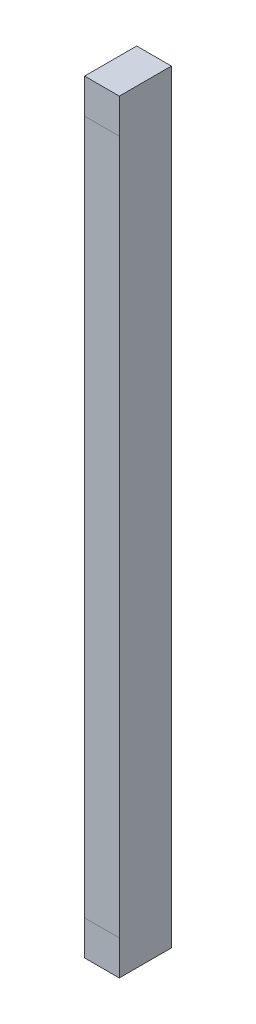
ISO-10303-21;
HEADER;
FILE_DESCRIPTION(('STEP AP214'),'2;1');
FILE_NAME('part.step','',(''),(''),'','','');
FILE_SCHEMA(('AUTOMOTIVE_DESIGN { 1 0 10303 214 1 1 1 1 }'));
ENDSEC;
DATA;
#1=APPLICATION_CONTEXT('core data for automotive mechanical design processes');
#2=APPLICATION_PROTOCOL_DEFINITION('international standard','automotive_design',2000,#1);
#3=PRODUCT_CONTEXT('',#1,'mechanical');
#4=PRODUCT('Part','Part','',(#3));
#5=PRODUCT_RELATED_PRODUCT_CATEGORY('part','',(#4));
#6=PRODUCT_DEFINITION_FORMATION('','',#4);
#7=PRODUCT_DEFINITION_CONTEXT('part definition',#1,'design');
#8=PRODUCT_DEFINITION('design','',#6,#7);
#9=PRODUCT_DEFINITION_SHAPE('','',#8);
#10=(LENGTH_UNIT() NAMED_UNIT(*) SI_UNIT(.MILLI.,.METRE.));
#11=(NAMED_UNIT(*) PLANE_ANGLE_UNIT() SI_UNIT($,.RADIAN.));
#12=(NAMED_UNIT(*) SI_UNIT($,.STERADIAN.) SOLID_ANGLE_UNIT());
#13=UNCERTAINTY_MEASURE_WITH_UNIT(LENGTH_MEASURE(1.E-05),#10,'distance_accuracy_value','');
#14=(GEOMETRIC_REPRESENTATION_CONTEXT(3) GLOBAL_UNCERTAINTY_ASSIGNED_CONTEXT((#13)) GLOBAL_UNIT_ASSIGNED_CONTEXT((#10,
#11,#12)) REPRESENTATION_CONTEXT('',''));
#15=CARTESIAN_POINT('',(0.,0.,0.));
#16=DIRECTION('',(0.,0.,1.));
#17=DIRECTION('',(1.,0.,0.));
#18=AXIS2_PLACEMENT_3D('',#15,#16,#17);
#19=CARTESIAN_POINT('',(0.,2200.,0.));
#20=DIRECTION('',(0.,0.,-1.));
#21=DIRECTION('',(-1.,0.,0.));
#22=AXIS2_PLACEMENT_3D('',#19,#20,#21);
#23=PLANE('',#22);
#24=DIRECTION('',(1.,0.,0.));
#25=VECTOR('',#24,1.);
#26=CARTESIAN_POINT('',(-1.74860126378462E-12,100.,0.));
#27=LINE('',#26,#25);
#28=CARTESIAN_POINT('',(0.,100.,0.));
#29=VERTEX_POINT('',#28);
#30=CARTESIAN_POINT('',(100.,100.,0.));
#31=VERTEX_POINT('',#30);
#32=EDGE_CURVE('E11',#29,#31,#27,.T.);
#33=ORIENTED_EDGE('',*,*,#32,.F.);
#34=DIRECTION('',(0.,-1.,0.));
#35=VECTOR('',#34,1.);
#36=CARTESIAN_POINT('',(0.,2200.,0.));
#37=LINE('',#36,#35);
#38=CARTESIAN_POINT('',(0.,0.,0.));
#39=VERTEX_POINT('',#38);
#40=EDGE_CURVE('E126',#29,#39,#37,.T.);
#41=ORIENTED_EDGE('',*,*,#40,.T.);
#42=DIRECTION('',(1.,0.,0.));
#43=VECTOR('',#42,1.);
#44=CARTESIAN_POINT('',(0.,0.,0.));
#45=LINE('',#44,#43);
#46=CARTESIAN_POINT('',(100.,0.,0.));
#47=VERTEX_POINT('',#46);
#48=EDGE_CURVE('E147',#39,#47,#45,.T.);
#49=ORIENTED_EDGE('',*,*,#48,.T.);
#50=DIRECTION('',(0.,-1.,0.));
#51=VECTOR('',#50,1.);
#52=CARTESIAN_POINT('',(100.,2200.,0.));
#53=LINE('',#52,#51);
#54=EDGE_CURVE('E132',#31,#47,#53,.T.);
#55=ORIENTED_EDGE('',*,*,#54,.F.);
#56=EDGE_LOOP('',(#33,#41,#49,#55));
#57=FACE_BOUND('',#56,.T.);
#58=ADVANCED_FACE('F49',(#57),#23,.F.);
#59=CARTESIAN_POINT('',(0.,2100.,0.));
#60=VERTEX_POINT('',#59);
#61=EDGE_CURVE('E124',#60,#29,#37,.T.);
#62=ORIENTED_EDGE('',*,*,#61,.T.);
#63=ORIENTED_EDGE('',*,*,#32,.T.);
#64=CARTESIAN_POINT('',(100.,2100.,0.));
#65=VERTEX_POINT('',#64);
#66=EDGE_CURVE('E131',#65,#31,#53,.T.);
#67=ORIENTED_EDGE('',*,*,#66,.F.);
#68=DIRECTION('',(1.,0.,0.));
#69=VECTOR('',#68,1.);
#70=CARTESIAN_POINT('',(0.,2100.,0.));
#71=LINE('',#70,#69);
#72=EDGE_CURVE('E58',#60,#65,#71,.T.);
#73=ORIENTED_EDGE('',*,*,#72,.F.);
#74=EDGE_LOOP('',(#62,#63,#67,#73));
#75=FACE_BOUND('',#74,.T.);
#76=ADVANCED_FACE('F158',(#75),#23,.F.);
#77=CARTESIAN_POINT('',(0.,2200.,0.));
#78=DIRECTION('',(1.,0.,0.));
#79=DIRECTION('',(0.,0.,-1.));
#80=AXIS2_PLACEMENT_3D('',#77,#78,#79);
#81=PLANE('',#80);
#82=DIRECTION('',(0.,0.,1.));
#83=VECTOR('',#82,1.);
#84=CARTESIAN_POINT('',(0.,0.,0.));
#85=LINE('',#84,#83);
#86=CARTESIAN_POINT('',(0.,0.,-150.));
#87=VERTEX_POINT('',#86);
#88=EDGE_CURVE('E149',#87,#39,#85,.T.);
#89=ORIENTED_EDGE('',*,*,#88,.T.);
#90=ORIENTED_EDGE('',*,*,#40,.F.);
#91=ORIENTED_EDGE('',*,*,#61,.F.);
#92=CARTESIAN_POINT('',(0.,2200.,0.));
#93=VERTEX_POINT('',#92);
#94=EDGE_CURVE('E105',#93,#60,#37,.T.);
#95=ORIENTED_EDGE('',*,*,#94,.F.);
#96=DIRECTION('',(0.,0.,1.));
#97=VECTOR('',#96,1.);
#98=CARTESIAN_POINT('',(0.,2200.,0.));
#99=LINE('',#98,#97);
#100=CARTESIAN_POINT('',(0.,2200.,-150.));
#101=VERTEX_POINT('',#100);
#102=EDGE_CURVE('E111',#101,#93,#99,.T.);
#103=ORIENTED_EDGE('',*,*,#102,.F.);
#104=DIRECTION('',(0.,-1.,0.));
#105=VECTOR('',#104,1.);
#106=CARTESIAN_POINT('',(0.,2200.,-150.));
#107=LINE('',#106,#105);
#108=EDGE_CURVE('E138',#101,#87,#107,.T.);
#109=ORIENTED_EDGE('',*,*,#108,.T.);
#110=EDGE_LOOP('',(#89,#90,#91,#95,#103,#109));
#111=FACE_BOUND('',#110,.T.);
#112=ADVANCED_FACE('F51',(#111),#81,.F.);
#113=ORIENTED_EDGE('',*,*,#94,.T.);
#114=ORIENTED_EDGE('',*,*,#72,.T.);
#115=CARTESIAN_POINT('',(100.,2200.,0.));
#116=VERTEX_POINT('',#115);
#117=EDGE_CURVE('E107',#116,#65,#53,.T.);
#118=ORIENTED_EDGE('',*,*,#117,.F.);
#119=DIRECTION('',(1.,0.,0.));
#120=VECTOR('',#119,1.);
#121=CARTESIAN_POINT('',(0.,2200.,0.));
#122=LINE('',#121,#120);
#123=EDGE_CURVE('E101',#93,#116,#122,.T.);
#124=ORIENTED_EDGE('',*,*,#123,.F.);
#125=EDGE_LOOP('',(#113,#114,#118,#124));
#126=FACE_BOUND('',#125,.T.);
#127=ADVANCED_FACE('F103',(#126),#23,.F.);
#128=CARTESIAN_POINT('',(100.,2200.,0.));
#129=DIRECTION('',(-1.,0.,0.));
#130=DIRECTION('',(0.,0.,1.));
#131=AXIS2_PLACEMENT_3D('',#128,#129,#130);
#132=PLANE('',#131);
#133=DIRECTION('',(0.,0.,-1.));
#134=VECTOR('',#133,1.);
#135=CARTESIAN_POINT('',(100.,0.,0.));
#136=LINE('',#135,#134);
#137=CARTESIAN_POINT('',(100.,0.,-150.));
#138=VERTEX_POINT('',#137);
#139=EDGE_CURVE('E145',#47,#138,#136,.T.);
#140=ORIENTED_EDGE('',*,*,#139,.T.);
#141=DIRECTION('',(0.,-1.,0.));
#142=VECTOR('',#141,1.);
#143=CARTESIAN_POINT('',(100.,2200.,-150.));
#144=LINE('',#143,#142);
#145=CARTESIAN_POINT('',(100.,2200.,-150.));
#146=VERTEX_POINT('',#145);
#147=EDGE_CURVE('E136',#146,#138,#144,.T.);
#148=ORIENTED_EDGE('',*,*,#147,.F.);
#149=DIRECTION('',(0.,0.,-1.));
#150=VECTOR('',#149,1.);
#151=CARTESIAN_POINT('',(100.,2200.,0.));
#152=LINE('',#151,#150);
#153=EDGE_CURVE('E110',#116,#146,#152,.T.);
#154=ORIENTED_EDGE('',*,*,#153,.F.);
#155=ORIENTED_EDGE('',*,*,#117,.T.);
#156=ORIENTED_EDGE('',*,*,#66,.T.);
#157=ORIENTED_EDGE('',*,*,#54,.T.);
#158=EDGE_LOOP('',(#140,#148,#154,#155,#156,#157));
#159=FACE_BOUND('',#158,.T.);
#160=ADVANCED_FACE('F152',(#159),#132,.F.);
#161=CARTESIAN_POINT('',(0.,2200.,-150.));
#162=DIRECTION('',(0.,0.,1.));
#163=DIRECTION('',(1.,0.,0.));
#164=AXIS2_PLACEMENT_3D('',#161,#162,#163);
#165=PLANE('',#164);
#166=DIRECTION('',(-1.,0.,0.));
#167=VECTOR('',#166,1.);
#168=CARTESIAN_POINT('',(0.,0.,-150.));
#169=LINE('',#168,#167);
#170=EDGE_CURVE('E120',#138,#87,#169,.T.);
#171=ORIENTED_EDGE('',*,*,#170,.T.);
#172=ORIENTED_EDGE('',*,*,#108,.F.);
#173=DIRECTION('',(-1.,0.,0.));
#174=VECTOR('',#173,1.);
#175=CARTESIAN_POINT('',(0.,2200.,-150.));
#176=LINE('',#175,#174);
#177=EDGE_CURVE('E116',#146,#101,#176,.T.);
#178=ORIENTED_EDGE('',*,*,#177,.F.);
#179=ORIENTED_EDGE('',*,*,#147,.T.);
#180=EDGE_LOOP('',(#171,#172,#178,#179));
#181=FACE_BOUND('',#180,.T.);
#182=ADVANCED_FACE('F154',(#181),#165,.F.);
#183=CARTESIAN_POINT('',(0.,2200.,0.));
#184=DIRECTION('',(0.,-1.,0.));
#185=DIRECTION('',(0.,0.,-1.));
#186=AXIS2_PLACEMENT_3D('',#183,#184,#185);
#187=PLANE('',#186);
#188=ORIENTED_EDGE('',*,*,#102,.T.);
#189=ORIENTED_EDGE('',*,*,#123,.T.);
#190=ORIENTED_EDGE('',*,*,#153,.T.);
#191=ORIENTED_EDGE('',*,*,#177,.T.);
#192=EDGE_LOOP('',(#188,#189,#190,#191));
#193=FACE_BOUND('',#192,.T.);
#194=ADVANCED_FACE('F114',(#193),#187,.F.);
#195=CARTESIAN_POINT('',(0.,0.,0.));
#196=DIRECTION('',(0.,-1.,0.));
#197=DIRECTION('',(0.,0.,-1.));
#198=AXIS2_PLACEMENT_3D('',#195,#196,#197);
#199=PLANE('',#198);
#200=ORIENTED_EDGE('',*,*,#88,.F.);
#201=ORIENTED_EDGE('',*,*,#170,.F.);
#202=ORIENTED_EDGE('',*,*,#139,.F.);
#203=ORIENTED_EDGE('',*,*,#48,.F.);
#204=EDGE_LOOP('',(#200,#201,#202,#203));
#205=FACE_BOUND('',#204,.T.);
#206=ADVANCED_FACE('F157',(#205),#199,.T.);
#207=CLOSED_SHELL('',(#58,#76,#112,#127,#160,#182,#194,#206));
#208=MANIFOLD_SOLID_BREP('B2',#207);
#209=ADVANCED_BREP_SHAPE_REPRESENTATION('',(#18,#208),#14);
#210=SHAPE_DEFINITION_REPRESENTATION(#9,#209);
ENDSEC;
END-ISO-10303-21;
